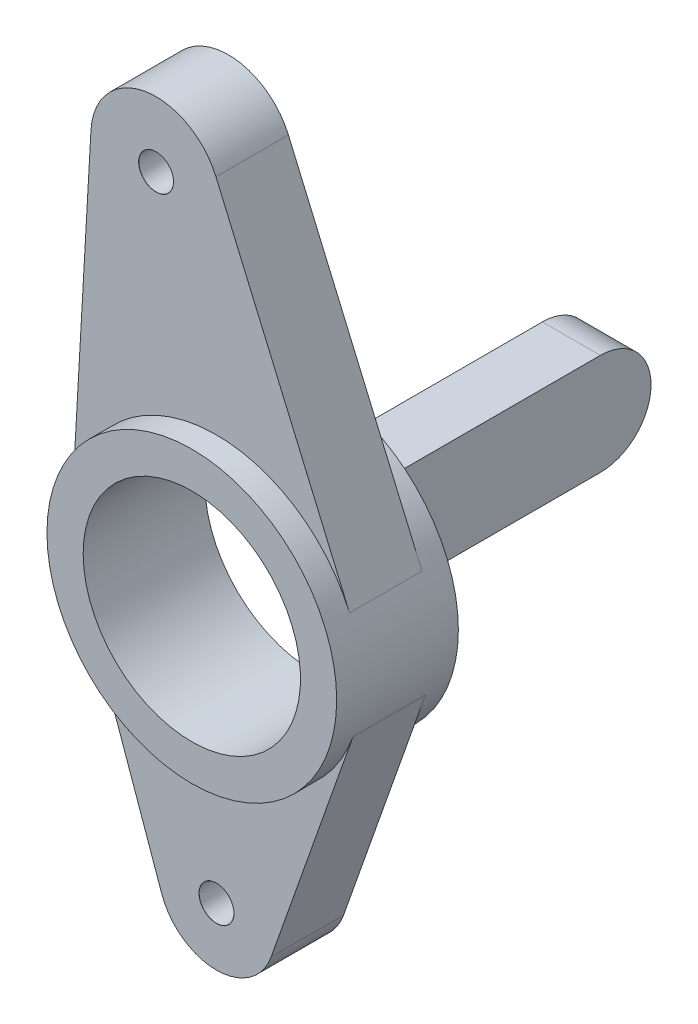
ISO-10303-21;
HEADER;
FILE_DESCRIPTION(('STEP AP214'),'2;1');
FILE_NAME('part.step','',(''),(''),'','','');
FILE_SCHEMA(('AUTOMOTIVE_DESIGN { 1 0 10303 214 1 1 1 1 }'));
ENDSEC;
DATA;
#1=APPLICATION_CONTEXT('core data for automotive mechanical design processes');
#2=APPLICATION_PROTOCOL_DEFINITION('international standard','automotive_design',2000,#1);
#3=PRODUCT_CONTEXT('',#1,'mechanical');
#4=PRODUCT('Part','Part','',(#3));
#5=PRODUCT_RELATED_PRODUCT_CATEGORY('part','',(#4));
#6=PRODUCT_DEFINITION_FORMATION('','',#4);
#7=PRODUCT_DEFINITION_CONTEXT('part definition',#1,'design');
#8=PRODUCT_DEFINITION('design','',#6,#7);
#9=PRODUCT_DEFINITION_SHAPE('','',#8);
#10=(LENGTH_UNIT() NAMED_UNIT(*) SI_UNIT(.MILLI.,.METRE.));
#11=(NAMED_UNIT(*) PLANE_ANGLE_UNIT() SI_UNIT($,.RADIAN.));
#12=(NAMED_UNIT(*) SI_UNIT($,.STERADIAN.) SOLID_ANGLE_UNIT());
#13=UNCERTAINTY_MEASURE_WITH_UNIT(LENGTH_MEASURE(1.E-05),#10,'distance_accuracy_value','');
#14=(GEOMETRIC_REPRESENTATION_CONTEXT(3) GLOBAL_UNCERTAINTY_ASSIGNED_CONTEXT((#13)) GLOBAL_UNIT_ASSIGNED_CONTEXT((#10,
#11,#12)) REPRESENTATION_CONTEXT('',''));
#15=CARTESIAN_POINT('',(0.,0.,0.));
#16=DIRECTION('',(0.,0.,1.));
#17=DIRECTION('',(1.,0.,0.));
#18=AXIS2_PLACEMENT_3D('',#15,#16,#17);
#19=CARTESIAN_POINT('',(0.,0.,21.));
#20=DIRECTION('',(0.,0.,-1.));
#21=DIRECTION('',(-1.,0.,0.));
#22=AXIS2_PLACEMENT_3D('',#19,#20,#21);
#23=CYLINDRICAL_SURFACE('',#22,37.5);
#24=CARTESIAN_POINT('',(0.,0.,-21.));
#25=DIRECTION('',(0.,0.,1.));
#26=DIRECTION('',(1.,0.,0.));
#27=AXIS2_PLACEMENT_3D('',#24,#25,#26);
#28=CIRCLE('',#27,37.5);
#29=CARTESIAN_POINT('',(-37.5,0.,-21.));
#30=VERTEX_POINT('',#29);
#31=EDGE_CURVE('E141',#30,#30,#28,.T.);
#32=CARTESIAN_POINT('',(0.,0.,21.));
#33=DIRECTION('',(0.,0.,1.));
#34=DIRECTION('',(1.,0.,0.));
#35=AXIS2_PLACEMENT_3D('',#32,#33,#34);
#36=CIRCLE('',#35,37.5);
#37=CARTESIAN_POINT('',(-37.5,0.,21.));
#38=VERTEX_POINT('',#37);
#39=EDGE_CURVE('E204',#38,#38,#36,.T.);
#40=CARTESIAN_POINT('',(-37.5,0.,-21.));
#41=CARTESIAN_POINT('',(-37.5,0.,-20.5625));
#42=CARTESIAN_POINT('',(-37.5,0.,-20.125));
#43=CARTESIAN_POINT('',(-37.5,0.,-19.25));
#44=CARTESIAN_POINT('',(-37.5,0.,-18.8125));
#45=CARTESIAN_POINT('',(-37.5,0.,-17.9375));
#46=CARTESIAN_POINT('',(-37.5,0.,-17.5));
#47=CARTESIAN_POINT('',(-37.5,0.,-16.625));
#48=CARTESIAN_POINT('',(-37.5,0.,-16.1875));
#49=CARTESIAN_POINT('',(-37.5,0.,-15.3125));
#50=CARTESIAN_POINT('',(-37.5,0.,-14.875));
#51=CARTESIAN_POINT('',(-37.5,0.,-14.));
#52=CARTESIAN_POINT('',(-37.5,0.,-13.5625));
#53=CARTESIAN_POINT('',(-37.5,0.,-12.6875));
#54=CARTESIAN_POINT('',(-37.5,0.,-12.25));
#55=CARTESIAN_POINT('',(-37.5,0.,-11.375));
#56=CARTESIAN_POINT('',(-37.5,0.,-10.9375));
#57=CARTESIAN_POINT('',(-37.5,0.,-10.0625));
#58=CARTESIAN_POINT('',(-37.5,0.,-9.625));
#59=CARTESIAN_POINT('',(-37.5,0.,-8.75));
#60=CARTESIAN_POINT('',(-37.5,0.,-8.3125));
#61=CARTESIAN_POINT('',(-37.5,0.,-7.4375));
#62=CARTESIAN_POINT('',(-37.5,0.,-7.));
#63=CARTESIAN_POINT('',(-37.5,0.,-6.125));
#64=CARTESIAN_POINT('',(-37.5,0.,-5.6875));
#65=CARTESIAN_POINT('',(-37.5,0.,-4.8125));
#66=CARTESIAN_POINT('',(-37.5,0.,-4.375));
#67=CARTESIAN_POINT('',(-37.5,0.,-3.5));
#68=CARTESIAN_POINT('',(-37.5,0.,-3.0625));
#69=CARTESIAN_POINT('',(-37.5,0.,-2.1875));
#70=CARTESIAN_POINT('',(-37.5,0.,-1.75));
#71=CARTESIAN_POINT('',(-37.5,0.,-0.875000000000001));
#72=CARTESIAN_POINT('',(-37.5,0.,-0.4375));
#73=CARTESIAN_POINT('',(-37.5,0.,0.4375));
#74=CARTESIAN_POINT('',(-37.5,0.,0.875000000000001));
#75=CARTESIAN_POINT('',(-37.5,0.,1.75));
#76=CARTESIAN_POINT('',(-37.5,0.,2.1875));
#77=CARTESIAN_POINT('',(-37.5,0.,3.0625));
#78=CARTESIAN_POINT('',(-37.5,0.,3.5));
#79=CARTESIAN_POINT('',(-37.5,0.,4.375));
#80=CARTESIAN_POINT('',(-37.5,0.,4.8125));
#81=CARTESIAN_POINT('',(-37.5,0.,5.6875));
#82=CARTESIAN_POINT('',(-37.5,0.,6.125));
#83=CARTESIAN_POINT('',(-37.5,0.,7.));
#84=CARTESIAN_POINT('',(-37.5,0.,7.4375));
#85=CARTESIAN_POINT('',(-37.5,0.,8.3125));
#86=CARTESIAN_POINT('',(-37.5,0.,8.75));
#87=CARTESIAN_POINT('',(-37.5,0.,9.625));
#88=CARTESIAN_POINT('',(-37.5,0.,10.0625));
#89=CARTESIAN_POINT('',(-37.5,0.,10.9375));
#90=CARTESIAN_POINT('',(-37.5,0.,11.375));
#91=CARTESIAN_POINT('',(-37.5,0.,12.25));
#92=CARTESIAN_POINT('',(-37.5,0.,12.6875));
#93=CARTESIAN_POINT('',(-37.5,0.,13.5625));
#94=CARTESIAN_POINT('',(-37.5,0.,14.));
#95=CARTESIAN_POINT('',(-37.5,0.,14.875));
#96=CARTESIAN_POINT('',(-37.5,0.,15.3125));
#97=CARTESIAN_POINT('',(-37.5,0.,16.1875));
#98=CARTESIAN_POINT('',(-37.5,0.,16.625));
#99=CARTESIAN_POINT('',(-37.5,0.,17.5));
#100=CARTESIAN_POINT('',(-37.5,0.,17.9375));
#101=CARTESIAN_POINT('',(-37.5,0.,18.8125));
#102=CARTESIAN_POINT('',(-37.5,0.,19.25));
#103=CARTESIAN_POINT('',(-37.5,0.,20.125));
#104=CARTESIAN_POINT('',(-37.5,0.,20.5625));
#105=CARTESIAN_POINT('',(-37.5,0.,21.));
#106=B_SPLINE_CURVE_WITH_KNOTS('',3,(#40,#41,#42,#43,#44,#45,#46,#47,#48,#49,#50,#51,#52,#53,
#54,#55,#56,#57,#58,#59,#60,#61,#62,#63,#64,#65,#66,#67,#68,#69,#70,#71,#72,#73,#74,#75,#76,#77,
#78,#79,#80,#81,#82,#83,#84,#85,#86,#87,#88,#89,#90,#91,#92,#93,#94,#95,#96,#97,#98,#99,#100,
#101,#102,#103,#104,#105),.UNSPECIFIED.,.F.,.F.,(4,2,2,2,2,2,2,2,2,2,2,2,2,2,2,2,2,2,2,2,2,2,2,
2,2,2,2,2,2,2,2,2,4),(0.,1.3125,2.625,3.9375,5.25,6.5625,7.875,9.1875,10.5,11.8125,13.125,
14.4375,15.75,17.0625,18.375,19.6875,21.,22.3125,23.625,24.9375,26.25,27.5625,28.875,30.1875,
31.5,32.8125,34.125,35.4375,36.75,38.0625,39.375,40.6875,42.),.UNSPECIFIED.);
#107=EDGE_CURVE('BSEAM54',#30,#38,#106,.T.);
#108=ORIENTED_EDGE('',*,*,#31,.F.);
#109=ORIENTED_EDGE('',*,*,#39,.T.);
#110=ORIENTED_EDGE('',*,*,#107,.T.);
#111=ORIENTED_EDGE('',*,*,#107,.F.);
#112=EDGE_LOOP('',(#108,#110,#109,#111));
#113=FACE_BOUND('',#112,.T.);
#114=ADVANCED_FACE('F54',(#113),#23,.F.);
#115=CARTESIAN_POINT('',(0.,0.,21.));
#116=DIRECTION('',(0.,0.,1.));
#117=DIRECTION('',(1.,0.,0.));
#118=AXIS2_PLACEMENT_3D('',#115,#116,#117);
#119=PLANE('',#118);
#120=CARTESIAN_POINT('',(0.,0.,21.));
#121=DIRECTION('',(0.,0.,1.));
#122=DIRECTION('',(1.,0.,0.));
#123=AXIS2_PLACEMENT_3D('',#120,#121,#122);
#124=CIRCLE('',#123,50.);
#125=CARTESIAN_POINT('',(50.,0.,21.));
#126=VERTEX_POINT('',#125);
#127=EDGE_CURVE('E268',#126,#126,#124,.T.);
#128=ORIENTED_EDGE('',*,*,#127,.T.);
#129=EDGE_LOOP('',(#128));
#130=FACE_BOUND('',#129,.T.);
#131=ORIENTED_EDGE('',*,*,#39,.F.);
#132=EDGE_LOOP('',(#131));
#133=FACE_BOUND('',#132,.T.);
#134=ADVANCED_FACE('F278',(#130,#133),#119,.T.);
#135=CARTESIAN_POINT('',(0.,0.,-21.));
#136=DIRECTION('',(0.,0.,1.));
#137=DIRECTION('',(1.,0.,0.));
#138=AXIS2_PLACEMENT_3D('',#135,#136,#137);
#139=PLANE('',#138);
#140=CARTESIAN_POINT('',(0.,0.,-21.));
#141=DIRECTION('',(0.,0.,1.));
#142=DIRECTION('',(1.,0.,0.));
#143=AXIS2_PLACEMENT_3D('',#140,#141,#142);
#144=CIRCLE('',#143,50.);
#145=CARTESIAN_POINT('',(50.,0.,-21.));
#146=VERTEX_POINT('',#145);
#147=EDGE_CURVE('E178',#146,#146,#144,.T.);
#148=ORIENTED_EDGE('',*,*,#147,.F.);
#149=EDGE_LOOP('',(#148));
#150=FACE_BOUND('',#149,.T.);
#151=ORIENTED_EDGE('',*,*,#31,.T.);
#152=EDGE_LOOP('',(#151));
#153=FACE_BOUND('',#152,.T.);
#154=ADVANCED_FACE('F282',(#150,#153),#139,.F.);
#155=CARTESIAN_POINT('',(0.,0.,21.));
#156=DIRECTION('',(0.,0.,-1.));
#157=DIRECTION('',(-1.,0.,0.));
#158=AXIS2_PLACEMENT_3D('',#155,#156,#157);
#159=CYLINDRICAL_SURFACE('',#158,50.);
#160=DIRECTION('',(0.,0.,-1.));
#161=VECTOR('',#160,1.);
#162=CARTESIAN_POINT('',(-47.1404520791032,-16.6666666666667,12.5));
#163=LINE('',#162,#161);
#164=CARTESIAN_POINT('',(-47.1404520791032,-16.6666666666667,12.5));
#165=VERTEX_POINT('',#164);
#166=CARTESIAN_POINT('',(-47.1404520791032,-16.6666666666667,-12.5));
#167=VERTEX_POINT('',#166);
#168=EDGE_CURVE('E136',#165,#167,#163,.T.);
#169=ORIENTED_EDGE('',*,*,#168,.F.);
#170=CARTESIAN_POINT('',(0.,0.,12.5));
#171=DIRECTION('',(0.,0.,1.));
#172=DIRECTION('',(1.,0.,0.));
#173=AXIS2_PLACEMENT_3D('',#170,#171,#172);
#174=CIRCLE('',#173,50.);
#175=CARTESIAN_POINT('',(47.1404520791032,-16.6666666666667,12.5));
#176=VERTEX_POINT('',#175);
#177=EDGE_CURVE('E133',#165,#176,#174,.T.);
#178=ORIENTED_EDGE('',*,*,#177,.T.);
#179=DIRECTION('',(0.,0.,-1.));
#180=VECTOR('',#179,1.);
#181=CARTESIAN_POINT('',(47.1404520791032,-16.6666666666667,12.5));
#182=LINE('',#181,#180);
#183=CARTESIAN_POINT('',(47.1404520791032,-16.6666666666667,-12.5));
#184=VERTEX_POINT('',#183);
#185=EDGE_CURVE('E139',#176,#184,#182,.T.);
#186=ORIENTED_EDGE('',*,*,#185,.T.);
#187=CARTESIAN_POINT('',(0.,0.,-12.5));
#188=DIRECTION('',(0.,0.,1.));
#189=DIRECTION('',(1.,0.,0.));
#190=AXIS2_PLACEMENT_3D('',#187,#188,#189);
#191=CIRCLE('',#190,50.);
#192=EDGE_CURVE('E190',#167,#184,#191,.T.);
#193=ORIENTED_EDGE('',*,*,#192,.F.);
#194=EDGE_LOOP('',(#169,#178,#186,#193));
#195=FACE_BOUND('',#194,.T.);
#196=CARTESIAN_POINT('',(45.9402443031795,19.7356011655128,12.5));
#197=VERTEX_POINT('',#196);
#198=CARTESIAN_POINT('',(-49.9196817080465,2.83290984101706,12.5));
#199=VERTEX_POINT('',#198);
#200=EDGE_CURVE('E144',#197,#199,#174,.T.);
#201=ORIENTED_EDGE('',*,*,#200,.T.);
#202=DIRECTION('',(0.,0.,-1.));
#203=VECTOR('',#202,1.);
#204=CARTESIAN_POINT('',(-49.9196817080465,2.83290984101706,12.5));
#205=LINE('',#204,#203);
#206=CARTESIAN_POINT('',(-49.9196817080465,2.83290984101706,-12.5));
#207=VERTEX_POINT('',#206);
#208=EDGE_CURVE('E157',#199,#207,#205,.T.);
#209=ORIENTED_EDGE('',*,*,#208,.T.);
#210=CARTESIAN_POINT('',(45.9402443031795,19.7356011655128,-12.5));
#211=VERTEX_POINT('',#210);
#212=EDGE_CURVE('E196',#211,#207,#191,.T.);
#213=ORIENTED_EDGE('',*,*,#212,.F.);
#214=DIRECTION('',(0.,0.,-1.));
#215=VECTOR('',#214,1.);
#216=CARTESIAN_POINT('',(45.9402443031795,19.7356011655128,12.5));
#217=LINE('',#216,#215);
#218=EDGE_CURVE('E163',#197,#211,#217,.T.);
#219=ORIENTED_EDGE('',*,*,#218,.F.);
#220=EDGE_LOOP('',(#201,#209,#213,#219));
#221=FACE_BOUND('',#220,.T.);
#222=ORIENTED_EDGE('',*,*,#127,.F.);
#223=EDGE_LOOP('',(#222));
#224=FACE_BOUND('',#223,.T.);
#225=ORIENTED_EDGE('',*,*,#147,.T.);
#226=EDGE_LOOP('',(#225));
#227=FACE_BOUND('',#226,.T.);
#228=ADVANCED_FACE('F135',(#195,#221,#224,#227),#159,.T.);
#229=CARTESIAN_POINT('',(0.,-90.,12.5));
#230=DIRECTION('',(0.,0.,-1.));
#231=DIRECTION('',(-1.,0.,0.));
#232=AXIS2_PLACEMENT_3D('',#229,#230,#231);
#233=CYLINDRICAL_SURFACE('',#232,20.);
#234=CARTESIAN_POINT('',(0.,-90.,-12.5));
#235=DIRECTION('',(0.,0.,1.));
#236=DIRECTION('',(1.,0.,0.));
#237=AXIS2_PLACEMENT_3D('',#234,#235,#236);
#238=CIRCLE('',#237,20.);
#239=CARTESIAN_POINT('',(-18.8561808316413,-96.6666666666667,-12.5));
#240=VERTEX_POINT('',#239);
#241=CARTESIAN_POINT('',(18.8561808316413,-96.6666666666667,-12.5));
#242=VERTEX_POINT('',#241);
#243=EDGE_CURVE('E187',#240,#242,#238,.T.);
#244=ORIENTED_EDGE('',*,*,#243,.T.);
#245=DIRECTION('',(0.,0.,-1.));
#246=VECTOR('',#245,1.);
#247=CARTESIAN_POINT('',(18.8561808316413,-96.6666666666667,12.5));
#248=LINE('',#247,#246);
#249=CARTESIAN_POINT('',(18.8561808316413,-96.6666666666667,12.5));
#250=VERTEX_POINT('',#249);
#251=EDGE_CURVE('E165',#250,#242,#248,.T.);
#252=ORIENTED_EDGE('',*,*,#251,.F.);
#253=CARTESIAN_POINT('',(0.,-90.,12.5));
#254=DIRECTION('',(0.,0.,1.));
#255=DIRECTION('',(1.,0.,0.));
#256=AXIS2_PLACEMENT_3D('',#253,#254,#255);
#257=CIRCLE('',#256,20.);
#258=CARTESIAN_POINT('',(-18.8561808316413,-96.6666666666667,12.5));
#259=VERTEX_POINT('',#258);
#260=EDGE_CURVE('E146',#259,#250,#257,.T.);
#261=ORIENTED_EDGE('',*,*,#260,.F.);
#262=DIRECTION('',(0.,0.,-1.));
#263=VECTOR('',#262,1.);
#264=CARTESIAN_POINT('',(-18.8561808316413,-96.6666666666667,12.5));
#265=LINE('',#264,#263);
#266=EDGE_CURVE('E181',#259,#240,#265,.T.);
#267=ORIENTED_EDGE('',*,*,#266,.T.);
#268=EDGE_LOOP('',(#244,#252,#261,#267));
#269=FACE_BOUND('',#268,.T.);
#270=ADVANCED_FACE('F293',(#269),#233,.T.);
#271=CARTESIAN_POINT('',(0.,-90.,12.5));
#272=DIRECTION('',(0.,0.,1.));
#273=DIRECTION('',(1.,0.,0.));
#274=AXIS2_PLACEMENT_3D('',#271,#272,#273);
#275=PLANE('',#274);
#276=CARTESIAN_POINT('',(0.,-90.,12.5));
#277=DIRECTION('',(0.,0.,1.));
#278=DIRECTION('',(1.,0.,0.));
#279=AXIS2_PLACEMENT_3D('',#276,#277,#278);
#280=CIRCLE('',#279,6.025);
#281=CARTESIAN_POINT('',(6.02500000000001,-90.,12.5));
#282=VERTEX_POINT('',#281);
#283=EDGE_CURVE('E225',#282,#282,#280,.T.);
#284=ORIENTED_EDGE('',*,*,#283,.F.);
#285=EDGE_LOOP('',(#284));
#286=FACE_BOUND('',#285,.T.);
#287=ORIENTED_EDGE('',*,*,#177,.F.);
#288=DIRECTION('',(0.333333333333334,-0.942809041582063,0.));
#289=VECTOR('',#288,1.);
#290=CARTESIAN_POINT('',(-18.8561808316413,-96.6666666666667,12.5));
#291=LINE('',#290,#289);
#292=EDGE_CURVE('E186',#165,#259,#291,.T.);
#293=ORIENTED_EDGE('',*,*,#292,.T.);
#294=ORIENTED_EDGE('',*,*,#260,.T.);
#295=DIRECTION('',(0.333333333333333,0.942809041582063,0.));
#296=VECTOR('',#295,1.);
#297=CARTESIAN_POINT('',(18.8561808316413,-96.6666666666667,12.5));
#298=LINE('',#297,#296);
#299=EDGE_CURVE('E107',#250,#176,#298,.T.);
#300=ORIENTED_EDGE('',*,*,#299,.T.);
#301=EDGE_LOOP('',(#287,#293,#294,#300));
#302=FACE_BOUND('',#301,.T.);
#303=ADVANCED_FACE('F148',(#286,#302),#275,.T.);
#304=CARTESIAN_POINT('',(0.,-90.,-12.5));
#305=DIRECTION('',(0.,0.,1.));
#306=DIRECTION('',(1.,0.,0.));
#307=AXIS2_PLACEMENT_3D('',#304,#305,#306);
#308=PLANE('',#307);
#309=CARTESIAN_POINT('',(0.,-90.,-12.5));
#310=DIRECTION('',(0.,0.,1.));
#311=DIRECTION('',(1.,0.,0.));
#312=AXIS2_PLACEMENT_3D('',#309,#310,#311);
#313=CIRCLE('',#312,5.99999999999999);
#314=CARTESIAN_POINT('',(6.,-90.,-12.5));
#315=VERTEX_POINT('',#314);
#316=EDGE_CURVE('E151',#315,#315,#313,.T.);
#317=ORIENTED_EDGE('',*,*,#316,.T.);
#318=EDGE_LOOP('',(#317));
#319=FACE_BOUND('',#318,.T.);
#320=DIRECTION('',(0.333333333333334,-0.942809041582063,0.));
#321=VECTOR('',#320,1.);
#322=CARTESIAN_POINT('',(-18.8561808316413,-96.6666666666667,-12.5));
#323=LINE('',#322,#321);
#324=EDGE_CURVE('E113',#167,#240,#323,.T.);
#325=ORIENTED_EDGE('',*,*,#324,.F.);
#326=ORIENTED_EDGE('',*,*,#192,.T.);
#327=DIRECTION('',(0.333333333333333,0.942809041582063,0.));
#328=VECTOR('',#327,1.);
#329=CARTESIAN_POINT('',(18.8561808316413,-96.6666666666667,-12.5));
#330=LINE('',#329,#328);
#331=EDGE_CURVE('E154',#242,#184,#330,.T.);
#332=ORIENTED_EDGE('',*,*,#331,.F.);
#333=ORIENTED_EDGE('',*,*,#243,.F.);
#334=EDGE_LOOP('',(#325,#326,#332,#333));
#335=FACE_BOUND('',#334,.T.);
#336=ADVANCED_FACE('F313',(#319,#335),#308,.F.);
#337=CARTESIAN_POINT('',(-18.8561808316413,-96.6666666666667,12.5));
#338=DIRECTION('',(0.942809041582063,0.333333333333334,0.));
#339=DIRECTION('',(-0.333333333333334,0.942809041582063,0.));
#340=AXIS2_PLACEMENT_3D('',#337,#338,#339);
#341=PLANE('',#340);
#342=ORIENTED_EDGE('',*,*,#324,.T.);
#343=ORIENTED_EDGE('',*,*,#266,.F.);
#344=ORIENTED_EDGE('',*,*,#292,.F.);
#345=ORIENTED_EDGE('',*,*,#168,.T.);
#346=EDGE_LOOP('',(#342,#343,#344,#345));
#347=FACE_BOUND('',#346,.T.);
#348=ADVANCED_FACE('F302',(#347),#341,.F.);
#349=CARTESIAN_POINT('',(18.8561808316413,-96.6666666666667,12.5));
#350=DIRECTION('',(-0.942809041582063,0.333333333333333,0.));
#351=DIRECTION('',(-0.333333333333333,-0.942809041582064,0.));
#352=AXIS2_PLACEMENT_3D('',#349,#350,#351);
#353=PLANE('',#352);
#354=ORIENTED_EDGE('',*,*,#331,.T.);
#355=ORIENTED_EDGE('',*,*,#185,.F.);
#356=ORIENTED_EDGE('',*,*,#299,.F.);
#357=ORIENTED_EDGE('',*,*,#251,.T.);
#358=EDGE_LOOP('',(#354,#355,#356,#357));
#359=FACE_BOUND('',#358,.T.);
#360=ADVANCED_FACE('F152',(#359),#353,.F.);
#361=CARTESIAN_POINT('',(-20.8377813200309,118.176930361465,12.5));
#362=DIRECTION('',(0.,0.,1.));
#363=DIRECTION('',(1.,0.,0.));
#364=AXIS2_PLACEMENT_3D('',#361,#362,#363);
#365=CIRCLE('',#364,6.025);
#366=CARTESIAN_POINT('',(-14.8127813200309,118.176930361465,12.5));
#367=VERTEX_POINT('',#366);
#368=EDGE_CURVE('E12',#367,#367,#365,.T.);
#369=ORIENTED_EDGE('',*,*,#368,.F.);
#370=EDGE_LOOP('',(#369));
#371=FACE_BOUND('',#370,.T.);
#372=ORIENTED_EDGE('',*,*,#200,.F.);
#373=DIRECTION('',(-0.394712023310255,0.918804886063589,0.));
#374=VECTOR('',#373,1.);
#375=CARTESIAN_POINT('',(-0.164671383600167,127.057950885946,12.5));
#376=LINE('',#375,#374);
#377=CARTESIAN_POINT('',(-0.164671383600167,127.057950885946,12.5));
#378=VERTEX_POINT('',#377);
#379=EDGE_CURVE('E101',#197,#378,#376,.T.);
#380=ORIENTED_EDGE('',*,*,#379,.T.);
#381=CARTESIAN_POINT('',(-20.8377813200309,118.176930361465,12.5));
#382=DIRECTION('',(0.,0.,1.));
#383=DIRECTION('',(1.,0.,0.));
#384=AXIS2_PLACEMENT_3D('',#381,#382,#383);
#385=CIRCLE('',#384,22.5);
#386=CARTESIAN_POINT('',(-43.3016380886518,119.451739789923,12.5));
#387=VERTEX_POINT('',#386);
#388=EDGE_CURVE('E215',#378,#387,#385,.T.);
#389=ORIENTED_EDGE('',*,*,#388,.T.);
#390=DIRECTION('',(-0.0566581968203411,-0.998393634160929,0.));
#391=VECTOR('',#390,1.);
#392=CARTESIAN_POINT('',(-43.3016380886518,119.451739789923,12.5));
#393=LINE('',#392,#391);
#394=EDGE_CURVE('E210',#387,#199,#393,.T.);
#395=ORIENTED_EDGE('',*,*,#394,.T.);
#396=EDGE_LOOP('',(#372,#380,#389,#395));
#397=FACE_BOUND('',#396,.T.);
#398=ADVANCED_FACE('F237',(#371,#397),#275,.T.);
#399=CARTESIAN_POINT('',(-20.8377813200309,118.176930361465,-12.5));
#400=DIRECTION('',(0.,0.,1.));
#401=DIRECTION('',(1.,0.,0.));
#402=AXIS2_PLACEMENT_3D('',#399,#400,#401);
#403=CIRCLE('',#402,5.99999999999999);
#404=CARTESIAN_POINT('',(-14.8377813200309,118.176930361465,-12.5));
#405=VERTEX_POINT('',#404);
#406=EDGE_CURVE('E211',#405,#405,#403,.T.);
#407=ORIENTED_EDGE('',*,*,#406,.T.);
#408=EDGE_LOOP('',(#407));
#409=FACE_BOUND('',#408,.T.);
#410=DIRECTION('',(-0.394712023310255,0.918804886063589,0.));
#411=VECTOR('',#410,1.);
#412=CARTESIAN_POINT('',(-0.164671383600167,127.057950885946,-12.5));
#413=LINE('',#412,#411);
#414=CARTESIAN_POINT('',(-0.164671383600167,127.057950885946,-12.5));
#415=VERTEX_POINT('',#414);
#416=EDGE_CURVE('E169',#211,#415,#413,.T.);
#417=ORIENTED_EDGE('',*,*,#416,.F.);
#418=ORIENTED_EDGE('',*,*,#212,.T.);
#419=DIRECTION('',(-0.0566581968203411,-0.998393634160929,0.));
#420=VECTOR('',#419,1.);
#421=CARTESIAN_POINT('',(-43.3016380886518,119.451739789923,-12.5));
#422=LINE('',#421,#420);
#423=CARTESIAN_POINT('',(-43.3016380886518,119.451739789923,-12.5));
#424=VERTEX_POINT('',#423);
#425=EDGE_CURVE('E172',#424,#207,#422,.T.);
#426=ORIENTED_EDGE('',*,*,#425,.F.);
#427=CARTESIAN_POINT('',(-20.8377813200309,118.176930361465,-12.5));
#428=DIRECTION('',(0.,0.,1.));
#429=DIRECTION('',(1.,0.,0.));
#430=AXIS2_PLACEMENT_3D('',#427,#428,#429);
#431=CIRCLE('',#430,22.5);
#432=EDGE_CURVE('E71',#415,#424,#431,.T.);
#433=ORIENTED_EDGE('',*,*,#432,.F.);
#434=EDGE_LOOP('',(#417,#418,#426,#433));
#435=FACE_BOUND('',#434,.T.);
#436=ADVANCED_FACE('F236',(#409,#435),#308,.F.);
#437=CARTESIAN_POINT('',(-0.164671383600167,127.057950885946,12.5));
#438=DIRECTION('',(-0.918804886063589,-0.394712023310255,0.));
#439=DIRECTION('',(0.394712023310255,-0.918804886063589,0.));
#440=AXIS2_PLACEMENT_3D('',#437,#438,#439);
#441=PLANE('',#440);
#442=ORIENTED_EDGE('',*,*,#416,.T.);
#443=DIRECTION('',(0.,0.,-1.));
#444=VECTOR('',#443,1.);
#445=CARTESIAN_POINT('',(-0.164671383600167,127.057950885946,12.5));
#446=LINE('',#445,#444);
#447=EDGE_CURVE('E166',#378,#415,#446,.T.);
#448=ORIENTED_EDGE('',*,*,#447,.F.);
#449=ORIENTED_EDGE('',*,*,#379,.F.);
#450=ORIENTED_EDGE('',*,*,#218,.T.);
#451=EDGE_LOOP('',(#442,#448,#449,#450));
#452=FACE_BOUND('',#451,.T.);
#453=ADVANCED_FACE('F244',(#452),#441,.F.);
#454=CARTESIAN_POINT('',(-20.8377813200309,118.176930361465,12.5));
#455=DIRECTION('',(0.,0.,-1.));
#456=DIRECTION('',(-1.,0.,0.));
#457=AXIS2_PLACEMENT_3D('',#454,#455,#456);
#458=CYLINDRICAL_SURFACE('',#457,22.5);
#459=ORIENTED_EDGE('',*,*,#432,.T.);
#460=DIRECTION('',(0.,0.,-1.));
#461=VECTOR('',#460,1.);
#462=CARTESIAN_POINT('',(-43.3016380886518,119.451739789923,12.5));
#463=LINE('',#462,#461);
#464=EDGE_CURVE('E174',#387,#424,#463,.T.);
#465=ORIENTED_EDGE('',*,*,#464,.F.);
#466=ORIENTED_EDGE('',*,*,#388,.F.);
#467=ORIENTED_EDGE('',*,*,#447,.T.);
#468=EDGE_LOOP('',(#459,#465,#466,#467));
#469=FACE_BOUND('',#468,.T.);
#470=ADVANCED_FACE('F247',(#469),#458,.T.);
#471=CARTESIAN_POINT('',(-43.3016380886518,119.451739789923,12.5));
#472=DIRECTION('',(0.998393634160929,-0.0566581968203411,0.));
#473=DIRECTION('',(0.0566581968203411,0.998393634160929,0.));
#474=AXIS2_PLACEMENT_3D('',#471,#472,#473);
#475=PLANE('',#474);
#476=ORIENTED_EDGE('',*,*,#425,.T.);
#477=ORIENTED_EDGE('',*,*,#208,.F.);
#478=ORIENTED_EDGE('',*,*,#394,.F.);
#479=ORIENTED_EDGE('',*,*,#464,.T.);
#480=EDGE_LOOP('',(#476,#477,#478,#479));
#481=FACE_BOUND('',#480,.T.);
#482=ADVANCED_FACE('F246',(#481),#475,.F.);
#483=CARTESIAN_POINT('',(0.,-90.,12.5));
#484=DIRECTION('',(0.,0.,1.));
#485=DIRECTION('',(1.,0.,0.));
#486=AXIS2_PLACEMENT_3D('',#483,#484,#485);
#487=CYLINDRICAL_SURFACE('',#486,5.99999999999999);
#488=CARTESIAN_POINT('',(0.,-90.,12.4758577806298));
#489=DIRECTION('',(0.,0.,1.));
#490=DIRECTION('',(1.,0.,0.));
#491=AXIS2_PLACEMENT_3D('',#488,#489,#490);
#492=CIRCLE('',#491,5.99999999999999);
#493=CARTESIAN_POINT('',(6.,-90.,12.4758577806298));
#494=VERTEX_POINT('',#493);
#495=EDGE_CURVE('E177',#494,#494,#492,.T.);
#496=ORIENTED_EDGE('',*,*,#495,.T.);
#497=EDGE_LOOP('',(#496));
#498=FACE_BOUND('',#497,.T.);
#499=ORIENTED_EDGE('',*,*,#316,.F.);
#500=EDGE_LOOP('',(#499));
#501=FACE_BOUND('',#500,.T.);
#502=ADVANCED_FACE('F306',(#498,#501),#487,.F.);
#503=CARTESIAN_POINT('',(0.,-90.,12.5));
#504=DIRECTION('',(0.,0.,1.));
#505=DIRECTION('',(1.,0.,0.));
#506=AXIS2_PLACEMENT_3D('',#503,#504,#505);
#507=CONICAL_SURFACE('',#506,6.025,0.802851455917305);
#508=ORIENTED_EDGE('',*,*,#495,.F.);
#509=EDGE_LOOP('',(#508));
#510=FACE_BOUND('',#509,.T.);
#511=ORIENTED_EDGE('',*,*,#283,.T.);
#512=EDGE_LOOP('',(#511));
#513=FACE_BOUND('',#512,.T.);
#514=ADVANCED_FACE('F318',(#510,#513),#507,.F.);
#515=CARTESIAN_POINT('',(-20.8377813200309,118.176930361465,12.5));
#516=DIRECTION('',(0.,0.,1.));
#517=DIRECTION('',(1.,0.,0.));
#518=AXIS2_PLACEMENT_3D('',#515,#516,#517);
#519=CYLINDRICAL_SURFACE('',#518,5.99999999999999);
#520=CARTESIAN_POINT('',(-20.8377813200309,118.176930361465,12.4758577806298));
#521=DIRECTION('',(0.,0.,1.));
#522=DIRECTION('',(1.,0.,0.));
#523=AXIS2_PLACEMENT_3D('',#520,#521,#522);
#524=CIRCLE('',#523,5.99999999999999);
#525=CARTESIAN_POINT('',(-14.8377813200309,118.176930361465,12.4758577806298));
#526=VERTEX_POINT('',#525);
#527=EDGE_CURVE('E65',#526,#526,#524,.T.);
#528=ORIENTED_EDGE('',*,*,#527,.T.);
#529=EDGE_LOOP('',(#528));
#530=FACE_BOUND('',#529,.T.);
#531=ORIENTED_EDGE('',*,*,#406,.F.);
#532=EDGE_LOOP('',(#531));
#533=FACE_BOUND('',#532,.T.);
#534=ADVANCED_FACE('F228',(#530,#533),#519,.F.);
#535=CARTESIAN_POINT('',(-20.8377813200309,118.176930361465,12.5));
#536=DIRECTION('',(0.,0.,1.));
#537=DIRECTION('',(1.,0.,0.));
#538=AXIS2_PLACEMENT_3D('',#535,#536,#537);
#539=CONICAL_SURFACE('',#538,6.025,0.802851455917305);
#540=ORIENTED_EDGE('',*,*,#527,.F.);
#541=EDGE_LOOP('',(#540));
#542=FACE_BOUND('',#541,.T.);
#543=ORIENTED_EDGE('',*,*,#368,.T.);
#544=EDGE_LOOP('',(#543));
#545=FACE_BOUND('',#544,.T.);
#546=ADVANCED_FACE('F60',(#542,#545),#539,.F.);
#547=CLOSED_SHELL('',(#114,#134,#154,#228,#270,#303,#336,#348,#360,#398,#436,#453,#470,#482,
#502,#514,#534,#546));
#548=MANIFOLD_SOLID_BREP('B2',#547);
#549=CARTESIAN_POINT('',(10.,0.,-110.));
#550=DIRECTION('',(1.,0.,0.));
#551=DIRECTION('',(0.,0.,-1.));
#552=AXIS2_PLACEMENT_3D('',#549,#550,#551);
#553=PLANE('',#552);
#554=DIRECTION('',(0.,0.,1.));
#555=VECTOR('',#554,1.);
#556=CARTESIAN_POINT('',(10.,17.5,-110.));
#557=LINE('',#556,#555);
#558=CARTESIAN_POINT('',(10.,17.5,-110.));
#559=VERTEX_POINT('',#558);
#560=CARTESIAN_POINT('',(10.,17.5,-22.));
#561=VERTEX_POINT('',#560);
#562=EDGE_CURVE('E537',#559,#561,#557,.T.);
#563=ORIENTED_EDGE('',*,*,#562,.T.);
#564=DIRECTION('',(0.,-1.,0.));
#565=VECTOR('',#564,1.);
#566=CARTESIAN_POINT('',(10.,0.,-22.));
#567=LINE('',#566,#565);
#568=CARTESIAN_POINT('',(10.,-17.5,-22.));
#569=VERTEX_POINT('',#568);
#570=EDGE_CURVE('E469',#561,#569,#567,.T.);
#571=ORIENTED_EDGE('',*,*,#570,.T.);
#572=DIRECTION('',(0.,0.,-1.));
#573=VECTOR('',#572,1.);
#574=CARTESIAN_POINT('',(10.,-17.5,-110.));
#575=LINE('',#574,#573);
#576=CARTESIAN_POINT('',(10.,-17.5,-110.));
#577=VERTEX_POINT('',#576);
#578=EDGE_CURVE('E474',#569,#577,#575,.T.);
#579=ORIENTED_EDGE('',*,*,#578,.T.);
#580=CARTESIAN_POINT('',(10.,0.,-110.));
#581=DIRECTION('',(1.,0.,0.));
#582=DIRECTION('',(0.,0.,-1.));
#583=AXIS2_PLACEMENT_3D('',#580,#581,#582);
#584=CIRCLE('',#583,17.5);
#585=EDGE_CURVE('E496',#577,#559,#584,.T.);
#586=ORIENTED_EDGE('',*,*,#585,.T.);
#587=EDGE_LOOP('',(#563,#571,#579,#586));
#588=FACE_BOUND('',#587,.T.);
#589=ADVANCED_FACE('F450',(#588),#553,.T.);
#590=CARTESIAN_POINT('',(-10.,0.,-110.));
#591=DIRECTION('',(1.,0.,0.));
#592=DIRECTION('',(0.,0.,-1.));
#593=AXIS2_PLACEMENT_3D('',#590,#591,#592);
#594=PLANE('',#593);
#595=DIRECTION('',(0.,-1.,0.));
#596=VECTOR('',#595,1.);
#597=CARTESIAN_POINT('',(-10.,0.,-22.));
#598=LINE('',#597,#596);
#599=CARTESIAN_POINT('',(-10.,17.5,-22.));
#600=VERTEX_POINT('',#599);
#601=CARTESIAN_POINT('',(-10.,-17.5,-22.));
#602=VERTEX_POINT('',#601);
#603=EDGE_CURVE('E545',#600,#602,#598,.T.);
#604=ORIENTED_EDGE('',*,*,#603,.F.);
#605=DIRECTION('',(0.,0.,1.));
#606=VECTOR('',#605,1.);
#607=CARTESIAN_POINT('',(-10.,17.5,-110.));
#608=LINE('',#607,#606);
#609=CARTESIAN_POINT('',(-10.,17.5,-110.));
#610=VERTEX_POINT('',#609);
#611=EDGE_CURVE('E498',#610,#600,#608,.T.);
#612=ORIENTED_EDGE('',*,*,#611,.F.);
#613=CARTESIAN_POINT('',(-10.,0.,-110.));
#614=DIRECTION('',(1.,0.,0.));
#615=DIRECTION('',(0.,0.,-1.));
#616=AXIS2_PLACEMENT_3D('',#613,#614,#615);
#617=CIRCLE('',#616,17.5);
#618=CARTESIAN_POINT('',(-10.,-17.5,-110.));
#619=VERTEX_POINT('',#618);
#620=EDGE_CURVE('E505',#619,#610,#617,.T.);
#621=ORIENTED_EDGE('',*,*,#620,.F.);
#622=DIRECTION('',(0.,0.,-1.));
#623=VECTOR('',#622,1.);
#624=CARTESIAN_POINT('',(-10.,-17.5,-110.));
#625=LINE('',#624,#623);
#626=EDGE_CURVE('E487',#602,#619,#625,.T.);
#627=ORIENTED_EDGE('',*,*,#626,.F.);
#628=EDGE_LOOP('',(#604,#612,#621,#627));
#629=FACE_BOUND('',#628,.T.);
#630=ADVANCED_FACE('F509',(#629),#594,.F.);
#631=CARTESIAN_POINT('',(10.,-17.5,-110.));
#632=DIRECTION('',(0.,1.,0.));
#633=DIRECTION('',(0.,0.,1.));
#634=AXIS2_PLACEMENT_3D('',#631,#632,#633);
#635=PLANE('',#634);
#636=DIRECTION('',(1.,0.,0.));
#637=VECTOR('',#636,1.);
#638=CARTESIAN_POINT('',(10.,-17.5,-22.));
#639=LINE('',#638,#637);
#640=EDGE_CURVE('E494',#602,#569,#639,.T.);
#641=ORIENTED_EDGE('',*,*,#640,.F.);
#642=ORIENTED_EDGE('',*,*,#626,.T.);
#643=DIRECTION('',(-1.,0.,0.));
#644=VECTOR('',#643,1.);
#645=CARTESIAN_POINT('',(10.,-17.5,-110.));
#646=LINE('',#645,#644);
#647=EDGE_CURVE('E495',#577,#619,#646,.T.);
#648=ORIENTED_EDGE('',*,*,#647,.F.);
#649=ORIENTED_EDGE('',*,*,#578,.F.);
#650=EDGE_LOOP('',(#641,#642,#648,#649));
#651=FACE_BOUND('',#650,.T.);
#652=ADVANCED_FACE('F491',(#651),#635,.F.);
#653=CARTESIAN_POINT('',(10.,17.5,-110.));
#654=DIRECTION('',(0.,-1.,0.));
#655=DIRECTION('',(0.,0.,-1.));
#656=AXIS2_PLACEMENT_3D('',#653,#654,#655);
#657=PLANE('',#656);
#658=DIRECTION('',(-1.,0.,0.));
#659=VECTOR('',#658,1.);
#660=CARTESIAN_POINT('',(10.,17.5,-22.));
#661=LINE('',#660,#659);
#662=EDGE_CURVE('E540',#561,#600,#661,.T.);
#663=ORIENTED_EDGE('',*,*,#662,.F.);
#664=ORIENTED_EDGE('',*,*,#562,.F.);
#665=DIRECTION('',(-1.,0.,0.));
#666=VECTOR('',#665,1.);
#667=CARTESIAN_POINT('',(10.,17.5,-110.));
#668=LINE('',#667,#666);
#669=EDGE_CURVE('E458',#559,#610,#668,.T.);
#670=ORIENTED_EDGE('',*,*,#669,.T.);
#671=ORIENTED_EDGE('',*,*,#611,.T.);
#672=EDGE_LOOP('',(#663,#664,#670,#671));
#673=FACE_BOUND('',#672,.T.);
#674=ADVANCED_FACE('F523',(#673),#657,.F.);
#675=CARTESIAN_POINT('',(0.,0.,21.));
#676=DIRECTION('',(0.,0.,1.));
#677=DIRECTION('',(1.,0.,0.));
#678=AXIS2_PLACEMENT_3D('',#675,#676,#677);
#679=CYLINDRICAL_SURFACE('',#678,4.99999999999999);
#680=CARTESIAN_POINT('',(4.99999999999999,0.,-127.5));
#681=CARTESIAN_POINT('',(4.99999515109512,0.274887255943128,-127.499996732359));
#682=CARTESIAN_POINT('',(4.9772555275597,0.549824369681453,-127.493460435051));
#683=CARTESIAN_POINT('',(4.88708932474421,1.09172997799247,-127.468022648628));
#684=CARTESIAN_POINT('',(4.81964583481476,1.35869541707404,-127.449116480252));
#685=CARTESIAN_POINT('',(4.64247990395873,1.87676075184467,-127.401017283727));
#686=CARTESIAN_POINT('',(4.53281640962012,2.12788220212056,-127.371838602658));
#687=CARTESIAN_POINT('',(4.27455502130412,2.60817190282317,-127.306249457914));
#688=CARTESIAN_POINT('',(4.12595305377411,2.83733785294541,-127.269838237701));
#689=CARTESIAN_POINT('',(3.7899124733177,3.27323611714735,-127.192618365639));
#690=CARTESIAN_POINT('',(3.60163811536179,3.47930930595233,-127.151726048629));
#691=CARTESIAN_POINT('',(3.19338064215581,3.85742839481088,-127.070668372892));
#692=CARTESIAN_POINT('',(2.97339278091951,4.0294691926946,-127.030503123985));
#693=CARTESIAN_POINT('',(2.50251604302261,4.3379947501607,-126.954575371883));
#694=CARTESIAN_POINT('',(2.25109503733745,4.47369552758351,-126.918917562644));
#695=CARTESIAN_POINT('',(1.72781997062346,4.70062926384969,-126.857283596024));
#696=CARTESIAN_POINT('',(1.45597031982419,4.79187178889367,-126.831305356147));
#697=CARTESIAN_POINT('',(0.906913092084761,4.92496082534618,-126.792840204876));
#698=CARTESIAN_POINT('',(0.630021593075282,4.96801383006869,-126.780024464159));
#699=CARTESIAN_POINT('',(0.0726721288898721,5.00726669473214,-126.768355205142));
#700=CARTESIAN_POINT('',(-0.207785048106443,5.00347673524998,-126.769498653032));
#701=CARTESIAN_POINT('',(-0.754671528667233,4.9501033690626,-126.785325859918));
#702=CARTESIAN_POINT('',(-1.0212608780364,4.90200814317312,-126.799569566234));
#703=CARTESIAN_POINT('',(-1.5424180491494,4.76378465210903,-126.839283708357));
#704=CARTESIAN_POINT('',(-1.79698478181992,4.67365258702331,-126.864755159083));
#705=CARTESIAN_POINT('',(-2.29061561105372,4.4527670284564,-126.924421588233));
#706=CARTESIAN_POINT('',(-2.52944268099725,4.321513779325,-126.95872291023));
#707=CARTESIAN_POINT('',(-2.98219140304044,4.02245947919412,-127.032130421963));
#708=CARTESIAN_POINT('',(-3.19610749433917,3.8546502918328,-127.071237680524));
#709=CARTESIAN_POINT('',(-3.60143093901395,3.47975999182636,-127.151656266434));
#710=CARTESIAN_POINT('',(-3.79168618991754,3.27143718711354,-127.192995114316));
#711=CARTESIAN_POINT('',(-4.13481500910122,2.82533070596533,-127.271906180452));
#712=CARTESIAN_POINT('',(-4.28768664010441,2.58754550370466,-127.309478203444));
#713=CARTESIAN_POINT('',(-4.55232183693494,2.08730768272866,-127.376913201639));
#714=CARTESIAN_POINT('',(-4.66385071701042,1.82472454452502,-127.406731887431));
#715=CARTESIAN_POINT('',(-4.84083472854209,1.28348307491865,-127.454981287189));
#716=CARTESIAN_POINT('',(-4.90630147311318,1.00482881452535,-127.473414871406));
#717=CARTESIAN_POINT('',(-4.98743321427362,0.449165971610875,-127.496371862867));
#718=CARTESIAN_POINT('',(-5.00466173843255,0.172403367151267,-127.501331821265));
#719=CARTESIAN_POINT('',(-4.99318183424739,-0.380066317013962,-127.498052117677));
#720=CARTESIAN_POINT('',(-4.96447891788519,-0.655773519392773,-127.489814039516));
#721=CARTESIAN_POINT('',(-4.86322388920935,-1.19254658357579,-127.46134816713));
#722=CARTESIAN_POINT('',(-4.79156704669151,-1.45379552933711,-127.441365325442));
#723=CARTESIAN_POINT('',(-4.60749874503831,-1.9605217155141,-127.391699968547));
#724=CARTESIAN_POINT('',(-4.49508257277666,-2.20599712812179,-127.362016331647));
#725=CARTESIAN_POINT('',(-4.22994165838718,-2.68010421280008,-127.295249029228));
#726=CARTESIAN_POINT('',(-4.07639700293664,-2.90825621635022,-127.258019079458));
#727=CARTESIAN_POINT('',(-3.73436873512227,-3.33609632014869,-127.180448677462));
#728=CARTESIAN_POINT('',(-3.54587717483864,-3.53577792710763,-127.140107518881));
#729=CARTESIAN_POINT('',(-3.13197664487633,-3.90776607085015,-127.059215490732));
#730=CARTESIAN_POINT('',(-2.90556181110211,-4.07896356851775,-127.018700921443));
#731=CARTESIAN_POINT('',(-2.42634352843859,-4.38098829016899,-126.943472368384));
#732=CARTESIAN_POINT('',(-2.17354099807283,-4.51181691871704,-126.908758182819));
#733=CARTESIAN_POINT('',(-1.64977197256098,-4.72843635295665,-126.849466281018));
#734=CARTESIAN_POINT('',(-1.37891059125231,-4.8144658309902,-126.824835000538));
#735=CARTESIAN_POINT('',(-0.825725161066671,-4.93948625169787,-126.788561416936));
#736=CARTESIAN_POINT('',(-0.543404612322596,-4.97849144754389,-126.776915178096));
#737=CARTESIAN_POINT('',(0.0132400823757048,-5.00745060616826,-126.768292577481));
#738=CARTESIAN_POINT('',(0.287463761481212,-4.99920069109391,-126.770779017604));
#739=CARTESIAN_POINT('',(0.830436826733116,-4.93811777392152,-126.788864927562));
#740=CARTESIAN_POINT('',(1.09918639524223,-4.88528625949612,-126.804463959836));
#741=CARTESIAN_POINT('',(1.6209459278904,-4.73764922042288,-126.846674429696));
#742=CARTESIAN_POINT('',(1.87408846751958,-4.64327729466073,-126.873171926408));
#743=CARTESIAN_POINT('',(2.36114683623883,-4.41557373253791,-126.934182570869));
#744=CARTESIAN_POINT('',(2.59505925318534,-4.28223520107836,-126.96869713701));
#745=CARTESIAN_POINT('',(3.04545880451097,-3.97516366337115,-127.0432917238));
#746=CARTESIAN_POINT('',(3.26110347835426,-3.80023069306841,-127.08351907949));
#747=CARTESIAN_POINT('',(3.66055973952516,-3.41714960094824,-127.164246127292));
#748=CARTESIAN_POINT('',(3.84436329777715,-3.20899312682135,-127.204745885425));
#749=CARTESIAN_POINT('',(4.17959296081637,-2.75893580216351,-127.282698989313));
#750=CARTESIAN_POINT('',(4.33006746817401,-2.51630625589945,-127.320047525936));
#751=CARTESIAN_POINT('',(4.58786446255506,-2.00812632411664,-127.386284894448));
#752=CARTESIAN_POINT('',(4.69521052983266,-1.74258856028684,-127.415178346757));
#753=CARTESIAN_POINT('',(4.8521188784886,-1.23229078833758,-127.458183618133));
#754=CARTESIAN_POINT('',(4.90743384171139,-0.989407519060972,-127.473742109052));
#755=CARTESIAN_POINT('',(4.98137414310535,-0.497695921965914,-127.494651096304));
#756=CARTESIAN_POINT('',(5.0000043899422,-0.248868394040228,-127.50000295835));
#757=CARTESIAN_POINT('',(4.99999999999999,0.,-127.5));
#758=B_SPLINE_CURVE_WITH_KNOTS('',3,(#680,#681,#682,#683,#684,#685,#686,#687,#688,#689,#690,
#691,#692,#693,#694,#695,#696,#697,#698,#699,#700,#701,#702,#703,#704,#705,#706,#707,#708,#709,
#710,#711,#712,#713,#714,#715,#716,#717,#718,#719,#720,#721,#722,#723,#724,#725,#726,#727,#728,
#729,#730,#731,#732,#733,#734,#735,#736,#737,#738,#739,#740,#741,#742,#743,#744,#745,#746,#747,
#748,#749,#750,#751,#752,#753,#754,#755,#756,#757),.UNSPECIFIED.,.T.,.F.,(4,2,2,2,2,2,2,2,2,2,2,
2,2,2,2,2,2,2,2,2,2,2,2,2,2,2,2,2,2,2,2,2,2,2,2,2,2,2,4),(0.,0.823748281355859,1.64780834948795,
2.47072203223835,3.29372183858789,4.13619528826953,4.97879494684283,5.83832688250142,
6.69767378862022,7.53498774656873,8.37211973078081,9.18211964575843,9.99219279470074,
10.8125200823278,11.6330301394812,12.4844625151101,13.3359390039338,14.1921775276588,
15.0482001004129,15.8761364425026,16.7039734359138,17.5151285120356,18.3263774144358,
19.1551881336589,19.9841875797423,20.8403026221559,21.69638787418,22.547864334201,
23.3990826447409,24.2181670405213,25.0372241048183,25.8479274074504,26.6587742501082,
27.4966914224279,28.3348195778806,29.1944494744229,30.053608731021,30.7994867011174,
31.5452648608617),.UNSPECIFIED.);
#759=CARTESIAN_POINT('',(4.99999999999999,0.,-127.5));
#760=VERTEX_POINT('',#759);
#761=EDGE_CURVE('E52',#760,#760,#758,.T.);
#762=ORIENTED_EDGE('',*,*,#761,.F.);
#763=EDGE_LOOP('',(#762));
#764=FACE_BOUND('',#763,.T.);
#765=CARTESIAN_POINT('',(0.,0.,-22.));
#766=DIRECTION('',(0.,0.,1.));
#767=DIRECTION('',(1.,0.,0.));
#768=AXIS2_PLACEMENT_3D('',#765,#766,#767);
#769=CIRCLE('',#768,4.99999999999999);
#770=CARTESIAN_POINT('',(4.99999999999999,0.,-22.));
#771=VERTEX_POINT('',#770);
#772=EDGE_CURVE('E453',#771,#771,#769,.F.);
#773=ORIENTED_EDGE('',*,*,#772,.F.);
#774=EDGE_LOOP('',(#773));
#775=FACE_BOUND('',#774,.T.);
#776=ADVANCED_FACE('F520',(#764,#775),#679,.F.);
#777=CARTESIAN_POINT('',(10.,0.,-110.));
#778=DIRECTION('',(-1.,0.,0.));
#779=DIRECTION('',(0.,0.,1.));
#780=AXIS2_PLACEMENT_3D('',#777,#778,#779);
#781=CYLINDRICAL_SURFACE('',#780,17.5);
#782=ORIENTED_EDGE('',*,*,#761,.T.);
#783=EDGE_LOOP('',(#782));
#784=FACE_BOUND('',#783,.T.);
#785=ORIENTED_EDGE('',*,*,#620,.T.);
#786=ORIENTED_EDGE('',*,*,#669,.F.);
#787=ORIENTED_EDGE('',*,*,#585,.F.);
#788=ORIENTED_EDGE('',*,*,#647,.T.);
#789=EDGE_LOOP('',(#785,#786,#787,#788));
#790=FACE_BOUND('',#789,.T.);
#791=ADVANCED_FACE('F454',(#784,#790),#781,.T.);
#792=CARTESIAN_POINT('',(0.,0.,-22.));
#793=DIRECTION('',(0.,0.,1.));
#794=DIRECTION('',(1.,0.,0.));
#795=AXIS2_PLACEMENT_3D('',#792,#793,#794);
#796=PLANE('',#795);
#797=ORIENTED_EDGE('',*,*,#772,.T.);
#798=EDGE_LOOP('',(#797));
#799=FACE_BOUND('',#798,.T.);
#800=ORIENTED_EDGE('',*,*,#640,.T.);
#801=ORIENTED_EDGE('',*,*,#570,.F.);
#802=ORIENTED_EDGE('',*,*,#662,.T.);
#803=ORIENTED_EDGE('',*,*,#603,.T.);
#804=EDGE_LOOP('',(#800,#801,#802,#803));
#805=FACE_BOUND('',#804,.T.);
#806=ADVANCED_FACE('F527',(#799,#805),#796,.T.);
#807=CLOSED_SHELL('',(#589,#630,#652,#674,#776,#791,#806));
#808=MANIFOLD_SOLID_BREP('B6',#807);
#809=ADVANCED_BREP_SHAPE_REPRESENTATION('',(#18,#548,#808),#14);
#810=SHAPE_DEFINITION_REPRESENTATION(#9,#809);
ENDSEC;
END-ISO-10303-21;
